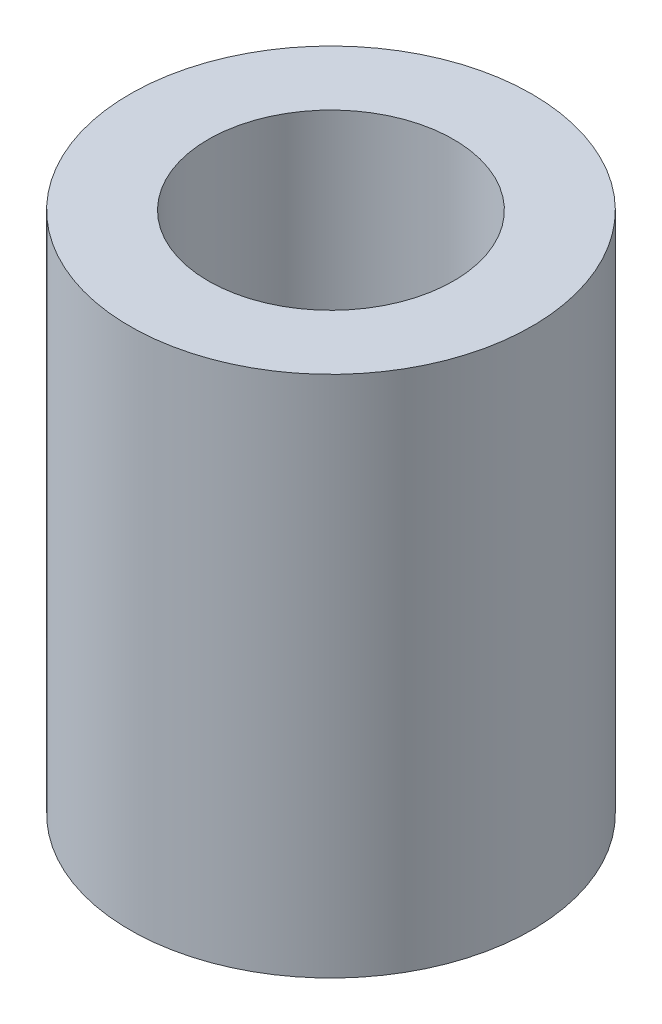
ISO-10303-21;
HEADER;
FILE_DESCRIPTION(('STEP AP214'),'2;1');
FILE_NAME('part.step','',(''),(''),'','','');
FILE_SCHEMA(('AUTOMOTIVE_DESIGN { 1 0 10303 214 1 1 1 1 }'));
ENDSEC;
DATA;
#1=APPLICATION_CONTEXT('core data for automotive mechanical design processes');
#2=APPLICATION_PROTOCOL_DEFINITION('international standard','automotive_design',2000,#1);
#3=PRODUCT_CONTEXT('',#1,'mechanical');
#4=PRODUCT('Part','Part','',(#3));
#5=PRODUCT_RELATED_PRODUCT_CATEGORY('part','',(#4));
#6=PRODUCT_DEFINITION_FORMATION('','',#4);
#7=PRODUCT_DEFINITION_CONTEXT('part definition',#1,'design');
#8=PRODUCT_DEFINITION('design','',#6,#7);
#9=PRODUCT_DEFINITION_SHAPE('','',#8);
#10=(LENGTH_UNIT() NAMED_UNIT(*) SI_UNIT(.MILLI.,.METRE.));
#11=(NAMED_UNIT(*) PLANE_ANGLE_UNIT() SI_UNIT($,.RADIAN.));
#12=(NAMED_UNIT(*) SI_UNIT($,.STERADIAN.) SOLID_ANGLE_UNIT());
#13=UNCERTAINTY_MEASURE_WITH_UNIT(LENGTH_MEASURE(1.E-05),#10,'distance_accuracy_value','');
#14=(GEOMETRIC_REPRESENTATION_CONTEXT(3) GLOBAL_UNCERTAINTY_ASSIGNED_CONTEXT((#13)) GLOBAL_UNIT_ASSIGNED_CONTEXT((#10,
#11,#12)) REPRESENTATION_CONTEXT('',''));
#15=CARTESIAN_POINT('',(0.,0.,0.));
#16=DIRECTION('',(0.,0.,1.));
#17=DIRECTION('',(1.,0.,0.));
#18=AXIS2_PLACEMENT_3D('',#15,#16,#17);
#19=CARTESIAN_POINT('',(0.,6.5,0.));
#20=DIRECTION('',(0.,-1.,0.));
#21=DIRECTION('',(0.,0.,-1.));
#22=AXIS2_PLACEMENT_3D('',#19,#20,#21);
#23=CYLINDRICAL_SURFACE('',#22,5.);
#24=CARTESIAN_POINT('',(0.,6.5,0.));
#25=DIRECTION('',(0.,1.,0.));
#26=DIRECTION('',(0.,0.,1.));
#27=AXIS2_PLACEMENT_3D('',#24,#25,#26);
#28=CIRCLE('',#27,5.);
#29=CARTESIAN_POINT('',(0.,6.5,-5.));
#30=VERTEX_POINT('',#29);
#31=EDGE_CURVE('E10',#30,#30,#28,.T.);
#32=CARTESIAN_POINT('',(0.,-6.5,0.));
#33=DIRECTION('',(0.,1.,0.));
#34=DIRECTION('',(0.,0.,1.));
#35=AXIS2_PLACEMENT_3D('',#32,#33,#34);
#36=CIRCLE('',#35,5.);
#37=CARTESIAN_POINT('',(0.,-6.5,-5.));
#38=VERTEX_POINT('',#37);
#39=EDGE_CURVE('E33',#38,#38,#36,.T.);
#40=CARTESIAN_POINT('',(0.,6.5,-5.));
#41=CARTESIAN_POINT('',(0.,6.36458333333333,-5.));
#42=CARTESIAN_POINT('',(0.,6.22916666666667,-5.));
#43=CARTESIAN_POINT('',(0.,5.95833333333333,-5.));
#44=CARTESIAN_POINT('',(0.,5.82291666666667,-5.));
#45=CARTESIAN_POINT('',(0.,5.55208333333333,-5.));
#46=CARTESIAN_POINT('',(0.,5.41666666666667,-5.));
#47=CARTESIAN_POINT('',(0.,5.14583333333333,-5.));
#48=CARTESIAN_POINT('',(0.,5.01041666666667,-5.));
#49=CARTESIAN_POINT('',(0.,4.73958333333333,-5.));
#50=CARTESIAN_POINT('',(0.,4.60416666666667,-5.));
#51=CARTESIAN_POINT('',(0.,4.33333333333333,-5.));
#52=CARTESIAN_POINT('',(0.,4.19791666666667,-5.));
#53=CARTESIAN_POINT('',(0.,3.92708333333333,-5.));
#54=CARTESIAN_POINT('',(0.,3.79166666666667,-5.));
#55=CARTESIAN_POINT('',(0.,3.52083333333333,-5.));
#56=CARTESIAN_POINT('',(0.,3.38541666666667,-5.));
#57=CARTESIAN_POINT('',(0.,3.11458333333333,-5.));
#58=CARTESIAN_POINT('',(0.,2.97916666666667,-5.));
#59=CARTESIAN_POINT('',(0.,2.70833333333333,-5.));
#60=CARTESIAN_POINT('',(0.,2.57291666666667,-5.));
#61=CARTESIAN_POINT('',(0.,2.30208333333333,-5.));
#62=CARTESIAN_POINT('',(0.,2.16666666666667,-5.));
#63=CARTESIAN_POINT('',(0.,1.89583333333333,-5.));
#64=CARTESIAN_POINT('',(0.,1.76041666666667,-5.));
#65=CARTESIAN_POINT('',(0.,1.48958333333333,-5.));
#66=CARTESIAN_POINT('',(0.,1.35416666666667,-5.));
#67=CARTESIAN_POINT('',(0.,1.08333333333333,-5.));
#68=CARTESIAN_POINT('',(0.,0.947916666666666,-5.));
#69=CARTESIAN_POINT('',(0.,0.677083333333332,-5.));
#70=CARTESIAN_POINT('',(0.,0.541666666666666,-5.));
#71=CARTESIAN_POINT('',(0.,0.270833333333333,-5.));
#72=CARTESIAN_POINT('',(0.,0.135416666666666,-5.));
#73=CARTESIAN_POINT('',(0.,-0.135416666666668,-5.));
#74=CARTESIAN_POINT('',(0.,-0.270833333333334,-5.));
#75=CARTESIAN_POINT('',(0.,-0.541666666666668,-5.));
#76=CARTESIAN_POINT('',(0.,-0.677083333333334,-5.));
#77=CARTESIAN_POINT('',(0.,-0.947916666666667,-5.));
#78=CARTESIAN_POINT('',(0.,-1.08333333333333,-5.));
#79=CARTESIAN_POINT('',(0.,-1.35416666666667,-5.));
#80=CARTESIAN_POINT('',(0.,-1.48958333333333,-5.));
#81=CARTESIAN_POINT('',(0.,-1.76041666666667,-5.));
#82=CARTESIAN_POINT('',(0.,-1.89583333333333,-5.));
#83=CARTESIAN_POINT('',(0.,-2.16666666666667,-5.));
#84=CARTESIAN_POINT('',(0.,-2.30208333333333,-5.));
#85=CARTESIAN_POINT('',(0.,-2.57291666666667,-5.));
#86=CARTESIAN_POINT('',(0.,-2.70833333333333,-5.));
#87=CARTESIAN_POINT('',(0.,-2.97916666666667,-5.));
#88=CARTESIAN_POINT('',(0.,-3.11458333333333,-5.));
#89=CARTESIAN_POINT('',(0.,-3.38541666666667,-5.));
#90=CARTESIAN_POINT('',(0.,-3.52083333333333,-5.));
#91=CARTESIAN_POINT('',(0.,-3.79166666666667,-5.));
#92=CARTESIAN_POINT('',(0.,-3.92708333333333,-5.));
#93=CARTESIAN_POINT('',(0.,-4.19791666666667,-5.));
#94=CARTESIAN_POINT('',(0.,-4.33333333333333,-5.));
#95=CARTESIAN_POINT('',(0.,-4.60416666666667,-5.));
#96=CARTESIAN_POINT('',(0.,-4.73958333333333,-5.));
#97=CARTESIAN_POINT('',(0.,-5.01041666666667,-5.));
#98=CARTESIAN_POINT('',(0.,-5.14583333333333,-5.));
#99=CARTESIAN_POINT('',(0.,-5.41666666666667,-5.));
#100=CARTESIAN_POINT('',(0.,-5.55208333333333,-5.));
#101=CARTESIAN_POINT('',(0.,-5.82291666666667,-5.));
#102=CARTESIAN_POINT('',(0.,-5.95833333333333,-5.));
#103=CARTESIAN_POINT('',(0.,-6.22916666666667,-5.));
#104=CARTESIAN_POINT('',(0.,-6.36458333333333,-5.));
#105=CARTESIAN_POINT('',(0.,-6.5,-5.));
#106=B_SPLINE_CURVE_WITH_KNOTS('',3,(#40,#41,#42,#43,#44,#45,#46,#47,#48,#49,#50,#51,#52,#53,
#54,#55,#56,#57,#58,#59,#60,#61,#62,#63,#64,#65,#66,#67,#68,#69,#70,#71,#72,#73,#74,#75,#76,#77,
#78,#79,#80,#81,#82,#83,#84,#85,#86,#87,#88,#89,#90,#91,#92,#93,#94,#95,#96,#97,#98,#99,#100,
#101,#102,#103,#104,#105),.UNSPECIFIED.,.F.,.F.,(4,2,2,2,2,2,2,2,2,2,2,2,2,2,2,2,2,2,2,2,2,2,2,
2,2,2,2,2,2,2,2,2,4),(0.,0.40625,0.8125,1.21875,1.625,2.03125,2.4375,2.84375,3.25,3.65625,
4.0625,4.46875,4.875,5.28125,5.6875,6.09375,6.5,6.90625,7.3125,7.71875,8.125,8.53125,8.9375,
9.34375,9.75,10.15625,10.5625,10.96875,11.375,11.78125,12.1875,12.59375,13.),.UNSPECIFIED.);
#107=EDGE_CURVE('BSEAM30',#30,#38,#106,.T.);
#108=ORIENTED_EDGE('',*,*,#31,.F.);
#109=ORIENTED_EDGE('',*,*,#39,.T.);
#110=ORIENTED_EDGE('',*,*,#107,.T.);
#111=ORIENTED_EDGE('',*,*,#107,.F.);
#112=EDGE_LOOP('',(#108,#110,#109,#111));
#113=FACE_BOUND('',#112,.T.);
#114=ADVANCED_FACE('F30',(#113),#23,.T.);
#115=CARTESIAN_POINT('',(0.,6.5,0.));
#116=DIRECTION('',(0.,1.,0.));
#117=DIRECTION('',(0.,0.,1.));
#118=AXIS2_PLACEMENT_3D('',#115,#116,#117);
#119=PLANE('',#118);
#120=CARTESIAN_POINT('',(0.,6.5,0.));
#121=DIRECTION('',(0.,1.,0.));
#122=DIRECTION('',(0.,0.,1.));
#123=AXIS2_PLACEMENT_3D('',#120,#121,#122);
#124=CIRCLE('',#123,3.05);
#125=CARTESIAN_POINT('',(0.,6.5,3.05));
#126=VERTEX_POINT('',#125);
#127=EDGE_CURVE('E42',#126,#126,#124,.T.);
#128=ORIENTED_EDGE('',*,*,#127,.F.);
#129=EDGE_LOOP('',(#128));
#130=FACE_BOUND('',#129,.T.);
#131=ORIENTED_EDGE('',*,*,#31,.T.);
#132=EDGE_LOOP('',(#131));
#133=FACE_BOUND('',#132,.T.);
#134=ADVANCED_FACE('F57',(#130,#133),#119,.T.);
#135=CARTESIAN_POINT('',(0.,-6.5,0.));
#136=DIRECTION('',(0.,1.,0.));
#137=DIRECTION('',(0.,0.,1.));
#138=AXIS2_PLACEMENT_3D('',#135,#136,#137);
#139=PLANE('',#138);
#140=CARTESIAN_POINT('',(0.,-6.5,0.));
#141=DIRECTION('',(0.,1.,0.));
#142=DIRECTION('',(0.,0.,1.));
#143=AXIS2_PLACEMENT_3D('',#140,#141,#142);
#144=CIRCLE('',#143,3.05);
#145=CARTESIAN_POINT('',(0.,-6.5,3.05));
#146=VERTEX_POINT('',#145);
#147=EDGE_CURVE('E40',#146,#146,#144,.T.);
#148=ORIENTED_EDGE('',*,*,#147,.T.);
#149=EDGE_LOOP('',(#148));
#150=FACE_BOUND('',#149,.T.);
#151=ORIENTED_EDGE('',*,*,#39,.F.);
#152=EDGE_LOOP('',(#151));
#153=FACE_BOUND('',#152,.T.);
#154=ADVANCED_FACE('F48',(#150,#153),#139,.F.);
#155=CARTESIAN_POINT('',(0.,-6.5,0.));
#156=DIRECTION('',(0.,1.,0.));
#157=DIRECTION('',(0.,0.,1.));
#158=AXIS2_PLACEMENT_3D('',#155,#156,#157);
#159=CYLINDRICAL_SURFACE('',#158,3.05);
#160=CARTESIAN_POINT('',(0.,-6.5,3.05));
#161=CARTESIAN_POINT('',(0.,-6.36458333333333,3.05));
#162=CARTESIAN_POINT('',(0.,-6.22916666666667,3.05));
#163=CARTESIAN_POINT('',(0.,-5.95833333333333,3.05));
#164=CARTESIAN_POINT('',(0.,-5.82291666666667,3.05));
#165=CARTESIAN_POINT('',(0.,-5.55208333333333,3.05));
#166=CARTESIAN_POINT('',(0.,-5.41666666666667,3.05));
#167=CARTESIAN_POINT('',(0.,-5.14583333333333,3.05));
#168=CARTESIAN_POINT('',(0.,-5.01041666666667,3.05));
#169=CARTESIAN_POINT('',(0.,-4.73958333333333,3.05));
#170=CARTESIAN_POINT('',(0.,-4.60416666666667,3.05));
#171=CARTESIAN_POINT('',(0.,-4.33333333333333,3.05));
#172=CARTESIAN_POINT('',(0.,-4.19791666666667,3.05));
#173=CARTESIAN_POINT('',(0.,-3.92708333333333,3.05));
#174=CARTESIAN_POINT('',(0.,-3.79166666666667,3.05));
#175=CARTESIAN_POINT('',(0.,-3.52083333333333,3.05));
#176=CARTESIAN_POINT('',(0.,-3.38541666666667,3.05));
#177=CARTESIAN_POINT('',(0.,-3.11458333333333,3.05));
#178=CARTESIAN_POINT('',(0.,-2.97916666666667,3.05));
#179=CARTESIAN_POINT('',(0.,-2.70833333333333,3.05));
#180=CARTESIAN_POINT('',(0.,-2.57291666666667,3.05));
#181=CARTESIAN_POINT('',(0.,-2.30208333333333,3.05));
#182=CARTESIAN_POINT('',(0.,-2.16666666666667,3.05));
#183=CARTESIAN_POINT('',(0.,-1.89583333333333,3.05));
#184=CARTESIAN_POINT('',(0.,-1.76041666666667,3.05));
#185=CARTESIAN_POINT('',(0.,-1.48958333333333,3.05));
#186=CARTESIAN_POINT('',(0.,-1.35416666666667,3.05));
#187=CARTESIAN_POINT('',(0.,-1.08333333333333,3.05));
#188=CARTESIAN_POINT('',(0.,-0.947916666666667,3.05));
#189=CARTESIAN_POINT('',(0.,-0.677083333333333,3.05));
#190=CARTESIAN_POINT('',(0.,-0.541666666666667,3.05));
#191=CARTESIAN_POINT('',(0.,-0.270833333333334,3.05));
#192=CARTESIAN_POINT('',(0.,-0.135416666666667,3.05));
#193=CARTESIAN_POINT('',(0.,0.135416666666667,3.05));
#194=CARTESIAN_POINT('',(0.,0.270833333333334,3.05));
#195=CARTESIAN_POINT('',(0.,0.541666666666667,3.05));
#196=CARTESIAN_POINT('',(0.,0.677083333333333,3.05));
#197=CARTESIAN_POINT('',(0.,0.947916666666667,3.05));
#198=CARTESIAN_POINT('',(0.,1.08333333333333,3.05));
#199=CARTESIAN_POINT('',(0.,1.35416666666667,3.05));
#200=CARTESIAN_POINT('',(0.,1.48958333333333,3.05));
#201=CARTESIAN_POINT('',(0.,1.76041666666667,3.05));
#202=CARTESIAN_POINT('',(0.,1.89583333333333,3.05));
#203=CARTESIAN_POINT('',(0.,2.16666666666667,3.05));
#204=CARTESIAN_POINT('',(0.,2.30208333333333,3.05));
#205=CARTESIAN_POINT('',(0.,2.57291666666667,3.05));
#206=CARTESIAN_POINT('',(0.,2.70833333333333,3.05));
#207=CARTESIAN_POINT('',(0.,2.97916666666667,3.05));
#208=CARTESIAN_POINT('',(0.,3.11458333333333,3.05));
#209=CARTESIAN_POINT('',(0.,3.38541666666667,3.05));
#210=CARTESIAN_POINT('',(0.,3.52083333333333,3.05));
#211=CARTESIAN_POINT('',(0.,3.79166666666667,3.05));
#212=CARTESIAN_POINT('',(0.,3.92708333333333,3.05));
#213=CARTESIAN_POINT('',(0.,4.19791666666667,3.05));
#214=CARTESIAN_POINT('',(0.,4.33333333333333,3.05));
#215=CARTESIAN_POINT('',(0.,4.60416666666667,3.05));
#216=CARTESIAN_POINT('',(0.,4.73958333333333,3.05));
#217=CARTESIAN_POINT('',(0.,5.01041666666667,3.05));
#218=CARTESIAN_POINT('',(0.,5.14583333333333,3.05));
#219=CARTESIAN_POINT('',(0.,5.41666666666667,3.05));
#220=CARTESIAN_POINT('',(0.,5.55208333333333,3.05));
#221=CARTESIAN_POINT('',(0.,5.82291666666667,3.05));
#222=CARTESIAN_POINT('',(0.,5.95833333333333,3.05));
#223=CARTESIAN_POINT('',(0.,6.22916666666667,3.05));
#224=CARTESIAN_POINT('',(0.,6.36458333333333,3.05));
#225=CARTESIAN_POINT('',(0.,6.5,3.05));
#226=B_SPLINE_CURVE_WITH_KNOTS('',3,(#160,#161,#162,#163,#164,#165,#166,#167,#168,#169,#170,
#171,#172,#173,#174,#175,#176,#177,#178,#179,#180,#181,#182,#183,#184,#185,#186,#187,#188,#189,
#190,#191,#192,#193,#194,#195,#196,#197,#198,#199,#200,#201,#202,#203,#204,#205,#206,#207,#208,
#209,#210,#211,#212,#213,#214,#215,#216,#217,#218,#219,#220,#221,#222,#223,#224,#225),
.UNSPECIFIED.,.F.,.F.,(4,2,2,2,2,2,2,2,2,2,2,2,2,2,2,2,2,2,2,2,2,2,2,2,2,2,2,2,2,2,2,2,4),(0.,
0.40625,0.8125,1.21875,1.625,2.03125,2.4375,2.84375,3.25,3.65625,4.0625,4.46875,4.875,5.28125,
5.6875,6.09375,6.5,6.90625,7.3125,7.71875,8.125,8.53125,8.9375,9.34375,9.75,10.15625,10.5625,
10.96875,11.375,11.78125,12.1875,12.59375,13.),.UNSPECIFIED.);
#227=EDGE_CURVE('BSEAM51',#146,#126,#226,.T.);
#228=ORIENTED_EDGE('',*,*,#147,.F.);
#229=ORIENTED_EDGE('',*,*,#127,.T.);
#230=ORIENTED_EDGE('',*,*,#227,.T.);
#231=ORIENTED_EDGE('',*,*,#227,.F.);
#232=EDGE_LOOP('',(#228,#230,#229,#231));
#233=FACE_BOUND('',#232,.T.);
#234=ADVANCED_FACE('F51',(#233),#159,.F.);
#235=CLOSED_SHELL('',(#114,#134,#154,#234));
#236=MANIFOLD_SOLID_BREP('B2',#235);
#237=ADVANCED_BREP_SHAPE_REPRESENTATION('',(#18,#236),#14);
#238=SHAPE_DEFINITION_REPRESENTATION(#9,#237);
ENDSEC;
END-ISO-10303-21;
